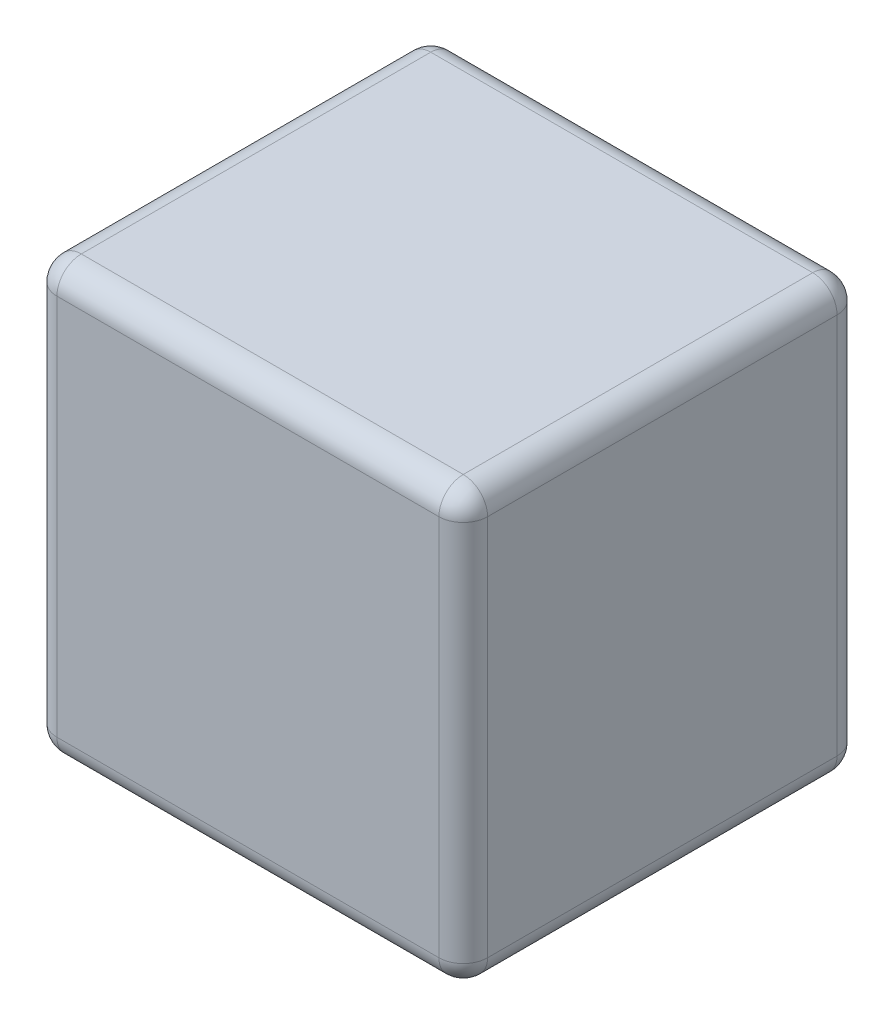
ISO-10303-21;
HEADER;
FILE_DESCRIPTION(('STEP AP214'),'2;1');
FILE_NAME('part.step','',(''),(''),'','','');
FILE_SCHEMA(('AUTOMOTIVE_DESIGN { 1 0 10303 214 1 1 1 1 }'));
ENDSEC;
DATA;
#1=APPLICATION_CONTEXT('core data for automotive mechanical design processes');
#2=APPLICATION_PROTOCOL_DEFINITION('international standard','automotive_design',2000,#1);
#3=PRODUCT_CONTEXT('',#1,'mechanical');
#4=PRODUCT('Part','Part','',(#3));
#5=PRODUCT_RELATED_PRODUCT_CATEGORY('part','',(#4));
#6=PRODUCT_DEFINITION_FORMATION('','',#4);
#7=PRODUCT_DEFINITION_CONTEXT('part definition',#1,'design');
#8=PRODUCT_DEFINITION('design','',#6,#7);
#9=PRODUCT_DEFINITION_SHAPE('','',#8);
#10=(LENGTH_UNIT() NAMED_UNIT(*) SI_UNIT(.MILLI.,.METRE.));
#11=(NAMED_UNIT(*) PLANE_ANGLE_UNIT() SI_UNIT($,.RADIAN.));
#12=(NAMED_UNIT(*) SI_UNIT($,.STERADIAN.) SOLID_ANGLE_UNIT());
#13=UNCERTAINTY_MEASURE_WITH_UNIT(LENGTH_MEASURE(1.E-05),#10,'distance_accuracy_value','');
#14=(GEOMETRIC_REPRESENTATION_CONTEXT(3) GLOBAL_UNCERTAINTY_ASSIGNED_CONTEXT((#13)) GLOBAL_UNIT_ASSIGNED_CONTEXT((#10,
#11,#12)) REPRESENTATION_CONTEXT('',''));
#15=CARTESIAN_POINT('',(0.,0.,0.));
#16=DIRECTION('',(0.,0.,1.));
#17=DIRECTION('',(1.,0.,0.));
#18=AXIS2_PLACEMENT_3D('',#15,#16,#17);
#19=CARTESIAN_POINT('',(-13.25,-13.25,24.5));
#20=DIRECTION('',(1.,0.,0.));
#21=DIRECTION('',(0.,0.,-1.));
#22=AXIS2_PLACEMENT_3D('',#19,#20,#21);
#23=PLANE('',#22);
#24=DIRECTION('',(0.,-1.,0.));
#25=VECTOR('',#24,1.);
#26=CARTESIAN_POINT('',(-13.25,13.25,23.));
#27=LINE('',#26,#25);
#28=CARTESIAN_POINT('',(-13.25,-11.75,23.));
#29=VERTEX_POINT('',#28);
#30=CARTESIAN_POINT('',(-13.25,11.75,23.));
#31=VERTEX_POINT('',#30);
#32=EDGE_CURVE('E163',#29,#31,#27,.F.);
#33=ORIENTED_EDGE('',*,*,#32,.T.);
#34=DIRECTION('',(0.,0.,-1.));
#35=VECTOR('',#34,1.);
#36=CARTESIAN_POINT('',(-13.25,11.75,24.5));
#37=LINE('',#36,#35);
#38=CARTESIAN_POINT('',(-13.25,11.75,1.5));
#39=VERTEX_POINT('',#38);
#40=EDGE_CURVE('E133',#31,#39,#37,.T.);
#41=ORIENTED_EDGE('',*,*,#40,.T.);
#42=DIRECTION('',(0.,-1.,0.));
#43=VECTOR('',#42,1.);
#44=CARTESIAN_POINT('',(-13.25,-13.25,1.5));
#45=LINE('',#44,#43);
#46=CARTESIAN_POINT('',(-13.25,-11.75,1.5));
#47=VERTEX_POINT('',#46);
#48=EDGE_CURVE('E153',#39,#47,#45,.T.);
#49=ORIENTED_EDGE('',*,*,#48,.T.);
#50=DIRECTION('',(0.,0.,-1.));
#51=VECTOR('',#50,1.);
#52=CARTESIAN_POINT('',(-13.25,-11.75,24.5));
#53=LINE('',#52,#51);
#54=EDGE_CURVE('E160',#47,#29,#53,.F.);
#55=ORIENTED_EDGE('',*,*,#54,.T.);
#56=EDGE_LOOP('',(#33,#41,#49,#55));
#57=FACE_BOUND('',#56,.T.);
#58=ADVANCED_FACE('F39',(#57),#23,.F.);
#59=CARTESIAN_POINT('',(13.25,-13.25,24.5));
#60=DIRECTION('',(0.,1.,0.));
#61=DIRECTION('',(-1.,0.,0.));
#62=AXIS2_PLACEMENT_3D('',#59,#60,#61);
#63=PLANE('',#62);
#64=DIRECTION('',(0.,0.,-1.));
#65=VECTOR('',#64,1.);
#66=CARTESIAN_POINT('',(-11.75,-13.25,24.5));
#67=LINE('',#66,#65);
#68=CARTESIAN_POINT('',(-11.75,-13.25,23.));
#69=VERTEX_POINT('',#68);
#70=CARTESIAN_POINT('',(-11.75,-13.25,1.5));
#71=VERTEX_POINT('',#70);
#72=EDGE_CURVE('E201',#69,#71,#67,.T.);
#73=ORIENTED_EDGE('',*,*,#72,.T.);
#74=DIRECTION('',(1.,0.,0.));
#75=VECTOR('',#74,1.);
#76=CARTESIAN_POINT('',(13.25,-13.25,1.5));
#77=LINE('',#76,#75);
#78=CARTESIAN_POINT('',(11.75,-13.25,1.5));
#79=VERTEX_POINT('',#78);
#80=EDGE_CURVE('E205',#71,#79,#77,.T.);
#81=ORIENTED_EDGE('',*,*,#80,.T.);
#82=DIRECTION('',(0.,0.,-1.));
#83=VECTOR('',#82,1.);
#84=CARTESIAN_POINT('',(11.75,-13.25,24.5));
#85=LINE('',#84,#83);
#86=CARTESIAN_POINT('',(11.75,-13.25,23.));
#87=VERTEX_POINT('',#86);
#88=EDGE_CURVE('E198',#79,#87,#85,.F.);
#89=ORIENTED_EDGE('',*,*,#88,.T.);
#90=DIRECTION('',(1.,0.,0.));
#91=VECTOR('',#90,1.);
#92=CARTESIAN_POINT('',(-13.25,-13.25,23.));
#93=LINE('',#92,#91);
#94=EDGE_CURVE('E195',#87,#69,#93,.F.);
#95=ORIENTED_EDGE('',*,*,#94,.T.);
#96=EDGE_LOOP('',(#73,#81,#89,#95));
#97=FACE_BOUND('',#96,.T.);
#98=ADVANCED_FACE('F331',(#97),#63,.F.);
#99=CARTESIAN_POINT('',(13.25,-13.25,24.5));
#100=DIRECTION('',(-1.,0.,0.));
#101=DIRECTION('',(0.,0.,1.));
#102=AXIS2_PLACEMENT_3D('',#99,#100,#101);
#103=PLANE('',#102);
#104=DIRECTION('',(0.,1.,0.));
#105=VECTOR('',#104,1.);
#106=CARTESIAN_POINT('',(13.25,-13.25,23.));
#107=LINE('',#106,#105);
#108=CARTESIAN_POINT('',(13.25,11.75,23.));
#109=VERTEX_POINT('',#108);
#110=CARTESIAN_POINT('',(13.25,-11.75,23.));
#111=VERTEX_POINT('',#110);
#112=EDGE_CURVE('E49',#109,#111,#107,.F.);
#113=ORIENTED_EDGE('',*,*,#112,.T.);
#114=DIRECTION('',(0.,0.,-1.));
#115=VECTOR('',#114,1.);
#116=CARTESIAN_POINT('',(13.25,-11.75,24.5));
#117=LINE('',#116,#115);
#118=CARTESIAN_POINT('',(13.25,-11.75,1.5));
#119=VERTEX_POINT('',#118);
#120=EDGE_CURVE('E11',#111,#119,#117,.T.);
#121=ORIENTED_EDGE('',*,*,#120,.T.);
#122=DIRECTION('',(0.,1.,0.));
#123=VECTOR('',#122,1.);
#124=CARTESIAN_POINT('',(13.25,-13.25,1.5));
#125=LINE('',#124,#123);
#126=CARTESIAN_POINT('',(13.25,11.75,1.5));
#127=VERTEX_POINT('',#126);
#128=EDGE_CURVE('E221',#119,#127,#125,.T.);
#129=ORIENTED_EDGE('',*,*,#128,.T.);
#130=DIRECTION('',(0.,0.,-1.));
#131=VECTOR('',#130,1.);
#132=CARTESIAN_POINT('',(13.25,11.75,24.5));
#133=LINE('',#132,#131);
#134=EDGE_CURVE('E60',#127,#109,#133,.F.);
#135=ORIENTED_EDGE('',*,*,#134,.T.);
#136=EDGE_LOOP('',(#113,#121,#129,#135));
#137=FACE_BOUND('',#136,.T.);
#138=ADVANCED_FACE('F343',(#137),#103,.F.);
#139=CARTESIAN_POINT('',(13.25,13.25,24.5));
#140=DIRECTION('',(0.,-1.,0.));
#141=DIRECTION('',(1.,0.,0.));
#142=AXIS2_PLACEMENT_3D('',#139,#140,#141);
#143=PLANE('',#142);
#144=DIRECTION('',(0.,0.,-1.));
#145=VECTOR('',#144,1.);
#146=CARTESIAN_POINT('',(11.75,13.25,24.5));
#147=LINE('',#146,#145);
#148=CARTESIAN_POINT('',(11.75,13.25,23.));
#149=VERTEX_POINT('',#148);
#150=CARTESIAN_POINT('',(11.75,13.25,1.5));
#151=VERTEX_POINT('',#150);
#152=EDGE_CURVE('E170',#149,#151,#147,.T.);
#153=ORIENTED_EDGE('',*,*,#152,.T.);
#154=DIRECTION('',(-1.,0.,0.));
#155=VECTOR('',#154,1.);
#156=CARTESIAN_POINT('',(13.25,13.25,1.5));
#157=LINE('',#156,#155);
#158=CARTESIAN_POINT('',(-11.75,13.25,1.5));
#159=VERTEX_POINT('',#158);
#160=EDGE_CURVE('E179',#151,#159,#157,.T.);
#161=ORIENTED_EDGE('',*,*,#160,.T.);
#162=DIRECTION('',(0.,0.,-1.));
#163=VECTOR('',#162,1.);
#164=CARTESIAN_POINT('',(-11.75,13.25,24.5));
#165=LINE('',#164,#163);
#166=CARTESIAN_POINT('',(-11.75,13.25,23.));
#167=VERTEX_POINT('',#166);
#168=EDGE_CURVE('E135',#159,#167,#165,.F.);
#169=ORIENTED_EDGE('',*,*,#168,.T.);
#170=DIRECTION('',(-1.,0.,0.));
#171=VECTOR('',#170,1.);
#172=CARTESIAN_POINT('',(13.25,13.25,23.));
#173=LINE('',#172,#171);
#174=EDGE_CURVE('E166',#167,#149,#173,.F.);
#175=ORIENTED_EDGE('',*,*,#174,.T.);
#176=EDGE_LOOP('',(#153,#161,#169,#175));
#177=FACE_BOUND('',#176,.T.);
#178=ADVANCED_FACE('F359',(#177),#143,.F.);
#179=CARTESIAN_POINT('',(0.,0.,24.5));
#180=DIRECTION('',(0.,0.,1.));
#181=DIRECTION('',(1.,0.,0.));
#182=AXIS2_PLACEMENT_3D('',#179,#180,#181);
#183=PLANE('',#182);
#184=DIRECTION('',(0.,-1.,0.));
#185=VECTOR('',#184,1.);
#186=CARTESIAN_POINT('',(-11.75,-13.25,24.5));
#187=LINE('',#186,#185);
#188=CARTESIAN_POINT('',(-11.75,11.75,24.5));
#189=VERTEX_POINT('',#188);
#190=CARTESIAN_POINT('',(-11.75,-11.75,24.5));
#191=VERTEX_POINT('',#190);
#192=EDGE_CURVE('E188',#189,#191,#187,.T.);
#193=ORIENTED_EDGE('',*,*,#192,.T.);
#194=DIRECTION('',(1.,0.,0.));
#195=VECTOR('',#194,1.);
#196=CARTESIAN_POINT('',(13.25,-11.75,24.5));
#197=LINE('',#196,#195);
#198=CARTESIAN_POINT('',(11.75,-11.75,24.5));
#199=VERTEX_POINT('',#198);
#200=EDGE_CURVE('E192',#191,#199,#197,.T.);
#201=ORIENTED_EDGE('',*,*,#200,.T.);
#202=DIRECTION('',(0.,1.,0.));
#203=VECTOR('',#202,1.);
#204=CARTESIAN_POINT('',(11.75,13.25,24.5));
#205=LINE('',#204,#203);
#206=CARTESIAN_POINT('',(11.75,11.75,24.5));
#207=VERTEX_POINT('',#206);
#208=EDGE_CURVE('E185',#199,#207,#205,.T.);
#209=ORIENTED_EDGE('',*,*,#208,.T.);
#210=DIRECTION('',(-1.,0.,0.));
#211=VECTOR('',#210,1.);
#212=CARTESIAN_POINT('',(-13.25,11.75,24.5));
#213=LINE('',#212,#211);
#214=EDGE_CURVE('E182',#207,#189,#213,.T.);
#215=ORIENTED_EDGE('',*,*,#214,.T.);
#216=EDGE_LOOP('',(#193,#201,#209,#215));
#217=FACE_BOUND('',#216,.T.);
#218=ADVANCED_FACE('F322',(#217),#183,.T.);
#219=CARTESIAN_POINT('',(0.,0.,0.));
#220=DIRECTION('',(0.,0.,1.));
#221=DIRECTION('',(1.,0.,0.));
#222=AXIS2_PLACEMENT_3D('',#219,#220,#221);
#223=PLANE('',#222);
#224=DIRECTION('',(0.,1.,0.));
#225=VECTOR('',#224,1.);
#226=CARTESIAN_POINT('',(11.75,0.,0.));
#227=LINE('',#226,#225);
#228=CARTESIAN_POINT('',(11.75,11.75,0.));
#229=VERTEX_POINT('',#228);
#230=CARTESIAN_POINT('',(11.75,-11.75,0.));
#231=VERTEX_POINT('',#230);
#232=EDGE_CURVE('E211',#229,#231,#227,.F.);
#233=ORIENTED_EDGE('',*,*,#232,.T.);
#234=DIRECTION('',(1.,0.,0.));
#235=VECTOR('',#234,1.);
#236=CARTESIAN_POINT('',(0.,-11.75,0.));
#237=LINE('',#236,#235);
#238=CARTESIAN_POINT('',(-11.75,-11.75,0.));
#239=VERTEX_POINT('',#238);
#240=EDGE_CURVE('E218',#231,#239,#237,.F.);
#241=ORIENTED_EDGE('',*,*,#240,.T.);
#242=DIRECTION('',(0.,-1.,0.));
#243=VECTOR('',#242,1.);
#244=CARTESIAN_POINT('',(-11.75,0.,0.));
#245=LINE('',#244,#243);
#246=CARTESIAN_POINT('',(-11.75,11.75,0.));
#247=VERTEX_POINT('',#246);
#248=EDGE_CURVE('E214',#239,#247,#245,.F.);
#249=ORIENTED_EDGE('',*,*,#248,.T.);
#250=DIRECTION('',(-1.,0.,0.));
#251=VECTOR('',#250,1.);
#252=CARTESIAN_POINT('',(0.,11.75,0.));
#253=LINE('',#252,#251);
#254=EDGE_CURVE('E208',#247,#229,#253,.F.);
#255=ORIENTED_EDGE('',*,*,#254,.T.);
#256=EDGE_LOOP('',(#233,#241,#249,#255));
#257=FACE_BOUND('',#256,.T.);
#258=ADVANCED_FACE('F530',(#257),#223,.F.);
#259=CARTESIAN_POINT('',(11.75,-11.75,24.5));
#260=DIRECTION('',(0.,0.,-1.));
#261=DIRECTION('',(-1.,0.,0.));
#262=AXIS2_PLACEMENT_3D('',#259,#260,#261);
#263=CYLINDRICAL_SURFACE('',#262,1.5);
#264=CARTESIAN_POINT('',(11.75,-11.75,23.));
#265=DIRECTION('',(0.,0.,1.));
#266=DIRECTION('',(1.,0.,0.));
#267=AXIS2_PLACEMENT_3D('',#264,#265,#266);
#268=CIRCLE('',#267,1.5);
#269=EDGE_CURVE('E43',#87,#111,#268,.T.);
#270=ORIENTED_EDGE('',*,*,#269,.F.);
#271=ORIENTED_EDGE('',*,*,#88,.F.);
#272=CARTESIAN_POINT('',(11.75,-11.75,1.5));
#273=DIRECTION('',(0.,0.,-1.));
#274=DIRECTION('',(-1.,0.,0.));
#275=AXIS2_PLACEMENT_3D('',#272,#273,#274);
#276=CIRCLE('',#275,1.5);
#277=EDGE_CURVE('E298',#119,#79,#276,.T.);
#278=ORIENTED_EDGE('',*,*,#277,.F.);
#279=ORIENTED_EDGE('',*,*,#120,.F.);
#280=EDGE_LOOP('',(#270,#271,#278,#279));
#281=FACE_BOUND('',#280,.T.);
#282=ADVANCED_FACE('F41',(#281),#263,.T.);
#283=CARTESIAN_POINT('',(11.75,-11.75,23.));
#284=DIRECTION('',(1.,0.,0.));
#285=DIRECTION('',(0.,0.,-1.));
#286=AXIS2_PLACEMENT_3D('',#283,#284,#285);
#287=SPHERICAL_SURFACE('',#286,1.5);
#288=CARTESIAN_POINT('',(11.75,-11.75,23.));
#289=DIRECTION('',(1.,0.,0.));
#290=DIRECTION('',(0.,0.,-1.));
#291=AXIS2_PLACEMENT_3D('',#288,#289,#290);
#292=CIRCLE('',#291,1.5);
#293=EDGE_CURVE('E291',#87,#199,#292,.F.);
#294=ORIENTED_EDGE('',*,*,#293,.F.);
#295=ORIENTED_EDGE('',*,*,#269,.T.);
#296=CARTESIAN_POINT('',(11.75,-11.75,23.));
#297=DIRECTION('',(0.,-1.,0.));
#298=DIRECTION('',(0.,0.,-1.));
#299=AXIS2_PLACEMENT_3D('',#296,#297,#298);
#300=CIRCLE('',#299,1.5);
#301=EDGE_CURVE('E295',#199,#111,#300,.F.);
#302=ORIENTED_EDGE('',*,*,#301,.F.);
#303=EDGE_LOOP('',(#294,#295,#302));
#304=FACE_BOUND('',#303,.T.);
#305=ADVANCED_FACE('F311',(#304),#287,.T.);
#306=CARTESIAN_POINT('',(11.75,-11.75,1.5));
#307=DIRECTION('',(0.,-1.,0.));
#308=DIRECTION('',(0.,0.,-1.));
#309=AXIS2_PLACEMENT_3D('',#306,#307,#308);
#310=SPHERICAL_SURFACE('',#309,1.5);
#311=CARTESIAN_POINT('',(11.75,-11.75,1.5));
#312=DIRECTION('',(0.,-1.,0.));
#313=DIRECTION('',(0.,0.,-1.));
#314=AXIS2_PLACEMENT_3D('',#311,#312,#313);
#315=CIRCLE('',#314,1.5);
#316=EDGE_CURVE('E283',#119,#231,#315,.F.);
#317=ORIENTED_EDGE('',*,*,#316,.F.);
#318=ORIENTED_EDGE('',*,*,#277,.T.);
#319=CARTESIAN_POINT('',(11.75,-11.75,1.5));
#320=DIRECTION('',(1.,0.,0.));
#321=DIRECTION('',(0.,0.,-1.));
#322=AXIS2_PLACEMENT_3D('',#319,#320,#321);
#323=CIRCLE('',#322,1.5);
#324=EDGE_CURVE('E287',#231,#79,#323,.F.);
#325=ORIENTED_EDGE('',*,*,#324,.F.);
#326=EDGE_LOOP('',(#317,#318,#325));
#327=FACE_BOUND('',#326,.T.);
#328=ADVANCED_FACE('F509',(#327),#310,.T.);
#329=CARTESIAN_POINT('',(11.75,0.,23.));
#330=DIRECTION('',(0.,-1.,0.));
#331=DIRECTION('',(0.,0.,-1.));
#332=AXIS2_PLACEMENT_3D('',#329,#330,#331);
#333=CYLINDRICAL_SURFACE('',#332,1.5);
#334=ORIENTED_EDGE('',*,*,#301,.T.);
#335=ORIENTED_EDGE('',*,*,#112,.F.);
#336=CARTESIAN_POINT('',(11.75,11.75,23.));
#337=DIRECTION('',(0.,1.,0.));
#338=DIRECTION('',(0.,0.,1.));
#339=AXIS2_PLACEMENT_3D('',#336,#337,#338);
#340=CIRCLE('',#339,1.5);
#341=EDGE_CURVE('E275',#207,#109,#340,.T.);
#342=ORIENTED_EDGE('',*,*,#341,.F.);
#343=ORIENTED_EDGE('',*,*,#208,.F.);
#344=EDGE_LOOP('',(#334,#335,#342,#343));
#345=FACE_BOUND('',#344,.T.);
#346=ADVANCED_FACE('F317',(#345),#333,.T.);
#347=CARTESIAN_POINT('',(0.,-11.75,23.));
#348=DIRECTION('',(-1.,0.,0.));
#349=DIRECTION('',(0.,-1.,0.));
#350=AXIS2_PLACEMENT_3D('',#347,#348,#349);
#351=CYLINDRICAL_SURFACE('',#350,1.5);
#352=ORIENTED_EDGE('',*,*,#293,.T.);
#353=ORIENTED_EDGE('',*,*,#200,.F.);
#354=CARTESIAN_POINT('',(-11.75,-11.75,23.));
#355=DIRECTION('',(-1.,0.,0.));
#356=DIRECTION('',(0.,0.,1.));
#357=AXIS2_PLACEMENT_3D('',#354,#355,#356);
#358=CIRCLE('',#357,1.5);
#359=EDGE_CURVE('E271',#69,#191,#358,.T.);
#360=ORIENTED_EDGE('',*,*,#359,.F.);
#361=ORIENTED_EDGE('',*,*,#94,.F.);
#362=EDGE_LOOP('',(#352,#353,#360,#361));
#363=FACE_BOUND('',#362,.T.);
#364=ADVANCED_FACE('F328',(#363),#351,.T.);
#365=CARTESIAN_POINT('',(-11.75,-11.75,24.5));
#366=DIRECTION('',(0.,0.,-1.));
#367=DIRECTION('',(-1.,0.,0.));
#368=AXIS2_PLACEMENT_3D('',#365,#366,#367);
#369=CYLINDRICAL_SURFACE('',#368,1.5);
#370=CARTESIAN_POINT('',(-11.75,-11.75,1.5));
#371=DIRECTION('',(0.,0.,-1.));
#372=DIRECTION('',(-1.,0.,0.));
#373=AXIS2_PLACEMENT_3D('',#370,#371,#372);
#374=CIRCLE('',#373,1.5);
#375=EDGE_CURVE('E263',#71,#47,#374,.T.);
#376=ORIENTED_EDGE('',*,*,#375,.F.);
#377=ORIENTED_EDGE('',*,*,#72,.F.);
#378=CARTESIAN_POINT('',(-11.75,-11.75,23.));
#379=DIRECTION('',(0.,0.,1.));
#380=DIRECTION('',(1.,0.,0.));
#381=AXIS2_PLACEMENT_3D('',#378,#379,#380);
#382=CIRCLE('',#381,1.5);
#383=EDGE_CURVE('E267',#29,#69,#382,.T.);
#384=ORIENTED_EDGE('',*,*,#383,.F.);
#385=ORIENTED_EDGE('',*,*,#54,.F.);
#386=EDGE_LOOP('',(#376,#377,#384,#385));
#387=FACE_BOUND('',#386,.T.);
#388=ADVANCED_FACE('F335',(#387),#369,.T.);
#389=CARTESIAN_POINT('',(13.25,-11.75,1.5));
#390=DIRECTION('',(1.,0.,0.));
#391=DIRECTION('',(0.,1.,0.));
#392=AXIS2_PLACEMENT_3D('',#389,#390,#391);
#393=CYLINDRICAL_SURFACE('',#392,1.5);
#394=ORIENTED_EDGE('',*,*,#324,.T.);
#395=ORIENTED_EDGE('',*,*,#80,.F.);
#396=CARTESIAN_POINT('',(-11.75,-11.75,1.5));
#397=DIRECTION('',(-1.,0.,0.));
#398=DIRECTION('',(0.,0.,1.));
#399=AXIS2_PLACEMENT_3D('',#396,#397,#398);
#400=CIRCLE('',#399,1.5);
#401=EDGE_CURVE('E260',#239,#71,#400,.T.);
#402=ORIENTED_EDGE('',*,*,#401,.F.);
#403=ORIENTED_EDGE('',*,*,#240,.F.);
#404=EDGE_LOOP('',(#394,#395,#402,#403));
#405=FACE_BOUND('',#404,.T.);
#406=ADVANCED_FACE('F341',(#405),#393,.T.);
#407=CARTESIAN_POINT('',(11.75,-13.25,1.5));
#408=DIRECTION('',(0.,1.,0.));
#409=DIRECTION('',(0.,0.,1.));
#410=AXIS2_PLACEMENT_3D('',#407,#408,#409);
#411=CYLINDRICAL_SURFACE('',#410,1.5);
#412=ORIENTED_EDGE('',*,*,#316,.T.);
#413=ORIENTED_EDGE('',*,*,#232,.F.);
#414=CARTESIAN_POINT('',(11.75,11.75,1.5));
#415=DIRECTION('',(0.,1.,0.));
#416=DIRECTION('',(0.,0.,1.));
#417=AXIS2_PLACEMENT_3D('',#414,#415,#416);
#418=CIRCLE('',#417,1.5);
#419=EDGE_CURVE('E256',#127,#229,#418,.T.);
#420=ORIENTED_EDGE('',*,*,#419,.F.);
#421=ORIENTED_EDGE('',*,*,#128,.F.);
#422=EDGE_LOOP('',(#412,#413,#420,#421));
#423=FACE_BOUND('',#422,.T.);
#424=ADVANCED_FACE('F352',(#423),#411,.T.);
#425=CARTESIAN_POINT('',(11.75,11.75,24.5));
#426=DIRECTION('',(0.,0.,-1.));
#427=DIRECTION('',(-1.,0.,0.));
#428=AXIS2_PLACEMENT_3D('',#425,#426,#427);
#429=CYLINDRICAL_SURFACE('',#428,1.5);
#430=CARTESIAN_POINT('',(11.75,11.75,23.));
#431=DIRECTION('',(0.,0.,1.));
#432=DIRECTION('',(1.,0.,0.));
#433=AXIS2_PLACEMENT_3D('',#430,#431,#432);
#434=CIRCLE('',#433,1.5);
#435=EDGE_CURVE('E279',#109,#149,#434,.T.);
#436=ORIENTED_EDGE('',*,*,#435,.F.);
#437=ORIENTED_EDGE('',*,*,#134,.F.);
#438=CARTESIAN_POINT('',(11.75,11.75,1.5));
#439=DIRECTION('',(0.,0.,-1.));
#440=DIRECTION('',(-1.,0.,0.));
#441=AXIS2_PLACEMENT_3D('',#438,#439,#440);
#442=CIRCLE('',#441,1.5);
#443=EDGE_CURVE('E252',#151,#127,#442,.T.);
#444=ORIENTED_EDGE('',*,*,#443,.F.);
#445=ORIENTED_EDGE('',*,*,#152,.F.);
#446=EDGE_LOOP('',(#436,#437,#444,#445));
#447=FACE_BOUND('',#446,.T.);
#448=ADVANCED_FACE('F348',(#447),#429,.T.);
#449=CARTESIAN_POINT('',(11.75,11.75,23.));
#450=DIRECTION('',(1.,0.,0.));
#451=DIRECTION('',(0.,0.,-1.));
#452=AXIS2_PLACEMENT_3D('',#449,#450,#451);
#453=SPHERICAL_SURFACE('',#452,1.5);
#454=ORIENTED_EDGE('',*,*,#341,.T.);
#455=ORIENTED_EDGE('',*,*,#435,.T.);
#456=CARTESIAN_POINT('',(11.75,11.75,23.));
#457=DIRECTION('',(1.,0.,0.));
#458=DIRECTION('',(0.,0.,-1.));
#459=AXIS2_PLACEMENT_3D('',#456,#457,#458);
#460=CIRCLE('',#459,1.5);
#461=EDGE_CURVE('E248',#207,#149,#460,.F.);
#462=ORIENTED_EDGE('',*,*,#461,.F.);
#463=EDGE_LOOP('',(#454,#455,#462));
#464=FACE_BOUND('',#463,.T.);
#465=ADVANCED_FACE('F362',(#464),#453,.T.);
#466=CARTESIAN_POINT('',(-11.75,-11.75,23.));
#467=DIRECTION('',(0.,-1.,0.));
#468=DIRECTION('',(0.,0.,-1.));
#469=AXIS2_PLACEMENT_3D('',#466,#467,#468);
#470=SPHERICAL_SURFACE('',#469,1.5);
#471=ORIENTED_EDGE('',*,*,#383,.T.);
#472=ORIENTED_EDGE('',*,*,#359,.T.);
#473=CARTESIAN_POINT('',(-11.75,-11.75,23.));
#474=DIRECTION('',(0.,-1.,0.));
#475=DIRECTION('',(0.,0.,-1.));
#476=AXIS2_PLACEMENT_3D('',#473,#474,#475);
#477=CIRCLE('',#476,1.5);
#478=EDGE_CURVE('E245',#29,#191,#477,.F.);
#479=ORIENTED_EDGE('',*,*,#478,.F.);
#480=EDGE_LOOP('',(#471,#472,#479));
#481=FACE_BOUND('',#480,.T.);
#482=ADVANCED_FACE('F372',(#481),#470,.T.);
#483=CARTESIAN_POINT('',(-11.75,-11.75,1.5));
#484=DIRECTION('',(0.,-1.,0.));
#485=DIRECTION('',(0.,0.,-1.));
#486=AXIS2_PLACEMENT_3D('',#483,#484,#485);
#487=SPHERICAL_SURFACE('',#486,1.5);
#488=ORIENTED_EDGE('',*,*,#401,.T.);
#489=ORIENTED_EDGE('',*,*,#375,.T.);
#490=CARTESIAN_POINT('',(-11.75,-11.75,1.5));
#491=DIRECTION('',(0.,-1.,0.));
#492=DIRECTION('',(0.,0.,-1.));
#493=AXIS2_PLACEMENT_3D('',#490,#491,#492);
#494=CIRCLE('',#493,1.5);
#495=EDGE_CURVE('E156',#239,#47,#494,.F.);
#496=ORIENTED_EDGE('',*,*,#495,.F.);
#497=EDGE_LOOP('',(#488,#489,#496));
#498=FACE_BOUND('',#497,.T.);
#499=ADVANCED_FACE('F374',(#498),#487,.T.);
#500=CARTESIAN_POINT('',(11.75,11.75,1.5));
#501=DIRECTION('',(1.,0.,0.));
#502=DIRECTION('',(0.,0.,-1.));
#503=AXIS2_PLACEMENT_3D('',#500,#501,#502);
#504=SPHERICAL_SURFACE('',#503,1.5);
#505=ORIENTED_EDGE('',*,*,#443,.T.);
#506=ORIENTED_EDGE('',*,*,#419,.T.);
#507=CARTESIAN_POINT('',(11.75,11.75,1.5));
#508=DIRECTION('',(1.,0.,0.));
#509=DIRECTION('',(0.,0.,-1.));
#510=AXIS2_PLACEMENT_3D('',#507,#508,#509);
#511=CIRCLE('',#510,1.5);
#512=EDGE_CURVE('E239',#151,#229,#511,.F.);
#513=ORIENTED_EDGE('',*,*,#512,.F.);
#514=EDGE_LOOP('',(#505,#506,#513));
#515=FACE_BOUND('',#514,.T.);
#516=ADVANCED_FACE('F354',(#515),#504,.T.);
#517=CARTESIAN_POINT('',(0.,11.75,23.));
#518=DIRECTION('',(1.,0.,0.));
#519=DIRECTION('',(0.,1.,0.));
#520=AXIS2_PLACEMENT_3D('',#517,#518,#519);
#521=CYLINDRICAL_SURFACE('',#520,1.5);
#522=ORIENTED_EDGE('',*,*,#461,.T.);
#523=ORIENTED_EDGE('',*,*,#174,.F.);
#524=CARTESIAN_POINT('',(-11.75,11.75,23.));
#525=DIRECTION('',(-1.,0.,0.));
#526=DIRECTION('',(0.,0.,1.));
#527=AXIS2_PLACEMENT_3D('',#524,#525,#526);
#528=CIRCLE('',#527,1.5);
#529=EDGE_CURVE('E235',#189,#167,#528,.T.);
#530=ORIENTED_EDGE('',*,*,#529,.F.);
#531=ORIENTED_EDGE('',*,*,#214,.F.);
#532=EDGE_LOOP('',(#522,#523,#530,#531));
#533=FACE_BOUND('',#532,.T.);
#534=ADVANCED_FACE('F364',(#533),#521,.T.);
#535=CARTESIAN_POINT('',(-11.75,0.,23.));
#536=DIRECTION('',(0.,1.,0.));
#537=DIRECTION('',(0.,0.,1.));
#538=AXIS2_PLACEMENT_3D('',#535,#536,#537);
#539=CYLINDRICAL_SURFACE('',#538,1.5);
#540=ORIENTED_EDGE('',*,*,#478,.T.);
#541=ORIENTED_EDGE('',*,*,#192,.F.);
#542=CARTESIAN_POINT('',(-11.75,11.75,23.));
#543=DIRECTION('',(0.,1.,0.));
#544=DIRECTION('',(0.,0.,1.));
#545=AXIS2_PLACEMENT_3D('',#542,#543,#544);
#546=CIRCLE('',#545,1.5);
#547=EDGE_CURVE('E150',#31,#189,#546,.T.);
#548=ORIENTED_EDGE('',*,*,#547,.F.);
#549=ORIENTED_EDGE('',*,*,#32,.F.);
#550=EDGE_LOOP('',(#540,#541,#548,#549));
#551=FACE_BOUND('',#550,.T.);
#552=ADVANCED_FACE('F370',(#551),#539,.T.);
#553=CARTESIAN_POINT('',(-11.75,-13.25,1.5));
#554=DIRECTION('',(0.,-1.,0.));
#555=DIRECTION('',(0.,0.,-1.));
#556=AXIS2_PLACEMENT_3D('',#553,#554,#555);
#557=CYLINDRICAL_SURFACE('',#556,1.5);
#558=ORIENTED_EDGE('',*,*,#495,.T.);
#559=ORIENTED_EDGE('',*,*,#48,.F.);
#560=CARTESIAN_POINT('',(-11.75,11.75,1.5));
#561=DIRECTION('',(0.,1.,0.));
#562=DIRECTION('',(-1.,0.,0.));
#563=AXIS2_PLACEMENT_3D('',#560,#561,#562);
#564=CIRCLE('',#563,1.5);
#565=EDGE_CURVE('E141',#247,#39,#564,.T.);
#566=ORIENTED_EDGE('',*,*,#565,.F.);
#567=ORIENTED_EDGE('',*,*,#248,.F.);
#568=EDGE_LOOP('',(#558,#559,#566,#567));
#569=FACE_BOUND('',#568,.T.);
#570=ADVANCED_FACE('F154',(#569),#557,.T.);
#571=CARTESIAN_POINT('',(13.25,11.75,1.5));
#572=DIRECTION('',(-1.,0.,0.));
#573=DIRECTION('',(0.,-1.,0.));
#574=AXIS2_PLACEMENT_3D('',#571,#572,#573);
#575=CYLINDRICAL_SURFACE('',#574,1.5);
#576=ORIENTED_EDGE('',*,*,#512,.T.);
#577=ORIENTED_EDGE('',*,*,#254,.F.);
#578=CARTESIAN_POINT('',(-11.75,11.75,1.5));
#579=DIRECTION('',(-1.,0.,0.));
#580=DIRECTION('',(0.,0.,1.));
#581=AXIS2_PLACEMENT_3D('',#578,#579,#580);
#582=CIRCLE('',#581,1.5);
#583=EDGE_CURVE('E145',#159,#247,#582,.T.);
#584=ORIENTED_EDGE('',*,*,#583,.F.);
#585=ORIENTED_EDGE('',*,*,#160,.F.);
#586=EDGE_LOOP('',(#576,#577,#584,#585));
#587=FACE_BOUND('',#586,.T.);
#588=ADVANCED_FACE('F357',(#587),#575,.T.);
#589=CARTESIAN_POINT('',(-11.75,11.75,23.));
#590=DIRECTION('',(0.,0.,1.));
#591=DIRECTION('',(1.,0.,0.));
#592=AXIS2_PLACEMENT_3D('',#589,#590,#591);
#593=SPHERICAL_SURFACE('',#592,1.5);
#594=ORIENTED_EDGE('',*,*,#547,.T.);
#595=ORIENTED_EDGE('',*,*,#529,.T.);
#596=CARTESIAN_POINT('',(-11.75,11.75,23.));
#597=DIRECTION('',(0.,0.,1.));
#598=DIRECTION('',(1.,0.,0.));
#599=AXIS2_PLACEMENT_3D('',#596,#597,#598);
#600=CIRCLE('',#599,1.5);
#601=EDGE_CURVE('E138',#31,#167,#600,.F.);
#602=ORIENTED_EDGE('',*,*,#601,.F.);
#603=EDGE_LOOP('',(#594,#595,#602));
#604=FACE_BOUND('',#603,.T.);
#605=ADVANCED_FACE('F368',(#604),#593,.T.);
#606=CARTESIAN_POINT('',(-11.75,11.75,1.5));
#607=DIRECTION('',(0.,0.,-1.));
#608=DIRECTION('',(-1.,0.,0.));
#609=AXIS2_PLACEMENT_3D('',#606,#607,#608);
#610=SPHERICAL_SURFACE('',#609,1.5);
#611=ORIENTED_EDGE('',*,*,#583,.T.);
#612=ORIENTED_EDGE('',*,*,#565,.T.);
#613=CARTESIAN_POINT('',(-11.75,11.75,1.5));
#614=DIRECTION('',(0.,0.,-1.));
#615=DIRECTION('',(-1.,0.,0.));
#616=AXIS2_PLACEMENT_3D('',#613,#614,#615);
#617=CIRCLE('',#616,1.5);
#618=EDGE_CURVE('E129',#159,#39,#617,.F.);
#619=ORIENTED_EDGE('',*,*,#618,.F.);
#620=EDGE_LOOP('',(#611,#612,#619));
#621=FACE_BOUND('',#620,.T.);
#622=ADVANCED_FACE('F143',(#621),#610,.T.);
#623=CARTESIAN_POINT('',(-11.75,11.75,24.5));
#624=DIRECTION('',(0.,0.,-1.));
#625=DIRECTION('',(-1.,0.,0.));
#626=AXIS2_PLACEMENT_3D('',#623,#624,#625);
#627=CYLINDRICAL_SURFACE('',#626,1.5);
#628=ORIENTED_EDGE('',*,*,#601,.T.);
#629=ORIENTED_EDGE('',*,*,#168,.F.);
#630=ORIENTED_EDGE('',*,*,#618,.T.);
#631=ORIENTED_EDGE('',*,*,#40,.F.);
#632=EDGE_LOOP('',(#628,#629,#630,#631));
#633=FACE_BOUND('',#632,.T.);
#634=ADVANCED_FACE('F131',(#633),#627,.T.);
#635=CLOSED_SHELL('',(#58,#98,#138,#178,#218,#258,#282,#305,#328,#346,#364,#388,#406,#424,#448,
#465,#482,#499,#516,#534,#552,#570,#588,#605,#622,#634));
#636=MANIFOLD_SOLID_BREP('B2',#635);
#637=ADVANCED_BREP_SHAPE_REPRESENTATION('',(#18,#636),#14);
#638=SHAPE_DEFINITION_REPRESENTATION(#9,#637);
ENDSEC;
END-ISO-10303-21;
